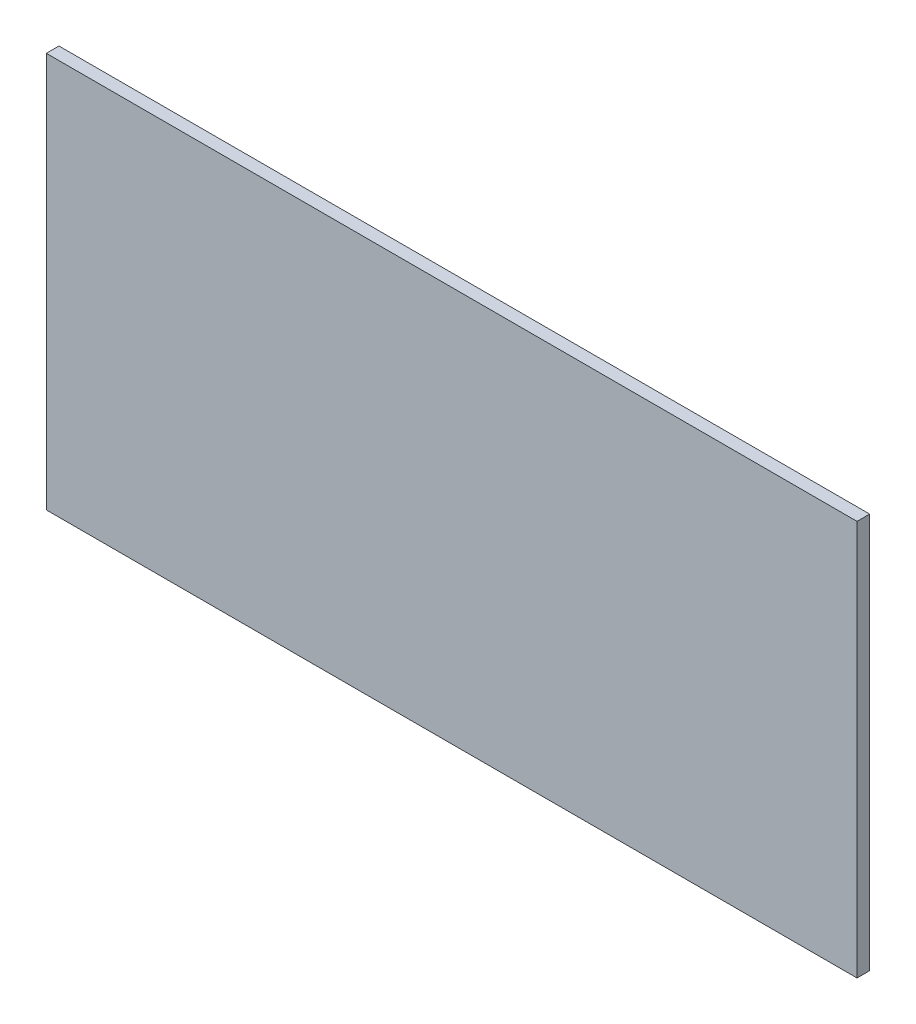
ISO-10303-21;
HEADER;
FILE_DESCRIPTION(('STEP AP214'),'2;1');
FILE_NAME('part.step','',(''),(''),'','','');
FILE_SCHEMA(('AUTOMOTIVE_DESIGN { 1 0 10303 214 1 1 1 1 }'));
ENDSEC;
DATA;
#1=APPLICATION_CONTEXT('core data for automotive mechanical design processes');
#2=APPLICATION_PROTOCOL_DEFINITION('international standard','automotive_design',2000,#1);
#3=PRODUCT_CONTEXT('',#1,'mechanical');
#4=PRODUCT('Part','Part','',(#3));
#5=PRODUCT_RELATED_PRODUCT_CATEGORY('part','',(#4));
#6=PRODUCT_DEFINITION_FORMATION('','',#4);
#7=PRODUCT_DEFINITION_CONTEXT('part definition',#1,'design');
#8=PRODUCT_DEFINITION('design','',#6,#7);
#9=PRODUCT_DEFINITION_SHAPE('','',#8);
#10=(LENGTH_UNIT() NAMED_UNIT(*) SI_UNIT(.MILLI.,.METRE.));
#11=(NAMED_UNIT(*) PLANE_ANGLE_UNIT() SI_UNIT($,.RADIAN.));
#12=(NAMED_UNIT(*) SI_UNIT($,.STERADIAN.) SOLID_ANGLE_UNIT());
#13=UNCERTAINTY_MEASURE_WITH_UNIT(LENGTH_MEASURE(1.E-05),#10,'distance_accuracy_value','');
#14=(GEOMETRIC_REPRESENTATION_CONTEXT(3) GLOBAL_UNCERTAINTY_ASSIGNED_CONTEXT((#13)) GLOBAL_UNIT_ASSIGNED_CONTEXT((#10,
#11,#12)) REPRESENTATION_CONTEXT('',''));
#15=CARTESIAN_POINT('',(0.,0.,0.));
#16=DIRECTION('',(0.,0.,1.));
#17=DIRECTION('',(1.,0.,0.));
#18=AXIS2_PLACEMENT_3D('',#15,#16,#17);
#19=CARTESIAN_POINT('',(585.7875,2.25518708062985E-13,18.25625));
#20=DIRECTION('',(-1.,0.,0.));
#21=DIRECTION('',(0.,-1.,0.));
#22=AXIS2_PLACEMENT_3D('',#19,#20,#21);
#23=PLANE('',#22);
#24=DIRECTION('',(0.,1.,0.));
#25=VECTOR('',#24,1.);
#26=CARTESIAN_POINT('',(585.7875,2.25518708062985E-13,0.));
#27=LINE('',#26,#25);
#28=CARTESIAN_POINT('',(585.7875,2.25518708062985E-13,0.));
#29=VERTEX_POINT('',#28);
#30=CARTESIAN_POINT('',(585.7875,571.5,0.));
#31=VERTEX_POINT('',#30);
#32=EDGE_CURVE('E96',#29,#31,#27,.T.);
#33=ORIENTED_EDGE('',*,*,#32,.T.);
#34=DIRECTION('',(0.,0.,-1.));
#35=VECTOR('',#34,1.);
#36=CARTESIAN_POINT('',(585.7875,571.5,18.25625));
#37=LINE('',#36,#35);
#38=CARTESIAN_POINT('',(585.7875,571.5,18.25625));
#39=VERTEX_POINT('',#38);
#40=EDGE_CURVE('E11',#39,#31,#37,.T.);
#41=ORIENTED_EDGE('',*,*,#40,.F.);
#42=DIRECTION('',(0.,1.,0.));
#43=VECTOR('',#42,1.);
#44=CARTESIAN_POINT('',(585.7875,2.25518708062985E-13,18.25625));
#45=LINE('',#44,#43);
#46=CARTESIAN_POINT('',(585.7875,2.25518708062985E-13,18.25625));
#47=VERTEX_POINT('',#46);
#48=EDGE_CURVE('E84',#47,#39,#45,.T.);
#49=ORIENTED_EDGE('',*,*,#48,.F.);
#50=DIRECTION('',(0.,0.,-1.));
#51=VECTOR('',#50,1.);
#52=CARTESIAN_POINT('',(585.7875,2.25518708062985E-13,18.25625));
#53=LINE('',#52,#51);
#54=EDGE_CURVE('E92',#47,#29,#53,.T.);
#55=ORIENTED_EDGE('',*,*,#54,.T.);
#56=EDGE_LOOP('',(#33,#41,#49,#55));
#57=FACE_BOUND('',#56,.T.);
#58=ADVANCED_FACE('F33',(#57),#23,.F.);
#59=CARTESIAN_POINT('',(585.7875,571.5,18.25625));
#60=DIRECTION('',(0.,-1.,0.));
#61=DIRECTION('',(1.,0.,0.));
#62=AXIS2_PLACEMENT_3D('',#59,#60,#61);
#63=PLANE('',#62);
#64=DIRECTION('',(-1.,0.,0.));
#65=VECTOR('',#64,1.);
#66=CARTESIAN_POINT('',(585.7875,571.5,0.));
#67=LINE('',#66,#65);
#68=CARTESIAN_POINT('',(-585.7875,571.5,0.));
#69=VERTEX_POINT('',#68);
#70=EDGE_CURVE('E88',#31,#69,#67,.T.);
#71=ORIENTED_EDGE('',*,*,#70,.T.);
#72=DIRECTION('',(0.,0.,-1.));
#73=VECTOR('',#72,1.);
#74=CARTESIAN_POINT('',(-585.7875,571.5,18.25625));
#75=LINE('',#74,#73);
#76=CARTESIAN_POINT('',(-585.7875,571.5,18.25625));
#77=VERTEX_POINT('',#76);
#78=EDGE_CURVE('E41',#77,#69,#75,.T.);
#79=ORIENTED_EDGE('',*,*,#78,.F.);
#80=DIRECTION('',(-1.,0.,0.));
#81=VECTOR('',#80,1.);
#82=CARTESIAN_POINT('',(585.7875,571.5,18.25625));
#83=LINE('',#82,#81);
#84=EDGE_CURVE('E79',#39,#77,#83,.T.);
#85=ORIENTED_EDGE('',*,*,#84,.F.);
#86=ORIENTED_EDGE('',*,*,#40,.T.);
#87=EDGE_LOOP('',(#71,#79,#85,#86));
#88=FACE_BOUND('',#87,.T.);
#89=ADVANCED_FACE('F87',(#88),#63,.F.);
#90=CARTESIAN_POINT('',(-585.7875,-1.3317268536478E-13,18.25625));
#91=DIRECTION('',(1.,0.,0.));
#92=DIRECTION('',(0.,0.,-1.));
#93=AXIS2_PLACEMENT_3D('',#90,#91,#92);
#94=PLANE('',#93);
#95=DIRECTION('',(0.,-1.,0.));
#96=VECTOR('',#95,1.);
#97=CARTESIAN_POINT('',(-585.7875,-1.3317268536478E-13,0.));
#98=LINE('',#97,#96);
#99=CARTESIAN_POINT('',(-585.7875,-1.3317268536478E-13,0.));
#100=VERTEX_POINT('',#99);
#101=EDGE_CURVE('E66',#69,#100,#98,.T.);
#102=ORIENTED_EDGE('',*,*,#101,.T.);
#103=DIRECTION('',(0.,0.,-1.));
#104=VECTOR('',#103,1.);
#105=CARTESIAN_POINT('',(-585.7875,-1.3317268536478E-13,18.25625));
#106=LINE('',#105,#104);
#107=CARTESIAN_POINT('',(-585.7875,-1.3317268536478E-13,18.25625));
#108=VERTEX_POINT('',#107);
#109=EDGE_CURVE('E89',#108,#100,#106,.T.);
#110=ORIENTED_EDGE('',*,*,#109,.F.);
#111=DIRECTION('',(0.,-1.,0.));
#112=VECTOR('',#111,1.);
#113=CARTESIAN_POINT('',(-585.7875,-1.3317268536478E-13,18.25625));
#114=LINE('',#113,#112);
#115=EDGE_CURVE('E82',#77,#108,#114,.T.);
#116=ORIENTED_EDGE('',*,*,#115,.F.);
#117=ORIENTED_EDGE('',*,*,#78,.T.);
#118=EDGE_LOOP('',(#102,#110,#116,#117));
#119=FACE_BOUND('',#118,.T.);
#120=ADVANCED_FACE('F90',(#119),#94,.F.);
#121=CARTESIAN_POINT('',(585.7875,2.25518708062985E-13,18.25625));
#122=DIRECTION('',(0.,1.,0.));
#123=DIRECTION('',(-1.,0.,0.));
#124=AXIS2_PLACEMENT_3D('',#121,#122,#123);
#125=PLANE('',#124);
#126=DIRECTION('',(1.,0.,0.));
#127=VECTOR('',#126,1.);
#128=CARTESIAN_POINT('',(585.7875,2.25518708062985E-13,0.));
#129=LINE('',#128,#127);
#130=EDGE_CURVE('E72',#100,#29,#129,.T.);
#131=ORIENTED_EDGE('',*,*,#130,.T.);
#132=ORIENTED_EDGE('',*,*,#54,.F.);
#133=DIRECTION('',(1.,0.,0.));
#134=VECTOR('',#133,1.);
#135=CARTESIAN_POINT('',(585.7875,2.25518708062985E-13,18.25625));
#136=LINE('',#135,#134);
#137=EDGE_CURVE('E49',#108,#47,#136,.T.);
#138=ORIENTED_EDGE('',*,*,#137,.F.);
#139=ORIENTED_EDGE('',*,*,#109,.T.);
#140=EDGE_LOOP('',(#131,#132,#138,#139));
#141=FACE_BOUND('',#140,.T.);
#142=ADVANCED_FACE('F103',(#141),#125,.F.);
#143=CARTESIAN_POINT('',(0.,0.,18.25625));
#144=DIRECTION('',(0.,0.,1.));
#145=DIRECTION('',(1.,0.,0.));
#146=AXIS2_PLACEMENT_3D('',#143,#144,#145);
#147=PLANE('',#146);
#148=ORIENTED_EDGE('',*,*,#48,.T.);
#149=ORIENTED_EDGE('',*,*,#84,.T.);
#150=ORIENTED_EDGE('',*,*,#115,.T.);
#151=ORIENTED_EDGE('',*,*,#137,.T.);
#152=EDGE_LOOP('',(#148,#149,#150,#151));
#153=FACE_BOUND('',#152,.T.);
#154=ADVANCED_FACE('F80',(#153),#147,.T.);
#155=CARTESIAN_POINT('',(0.,0.,0.));
#156=DIRECTION('',(0.,0.,1.));
#157=DIRECTION('',(1.,0.,0.));
#158=AXIS2_PLACEMENT_3D('',#155,#156,#157);
#159=PLANE('',#158);
#160=ORIENTED_EDGE('',*,*,#32,.F.);
#161=ORIENTED_EDGE('',*,*,#130,.F.);
#162=ORIENTED_EDGE('',*,*,#101,.F.);
#163=ORIENTED_EDGE('',*,*,#70,.F.);
#164=EDGE_LOOP('',(#160,#161,#162,#163));
#165=FACE_BOUND('',#164,.T.);
#166=ADVANCED_FACE('F106',(#165),#159,.F.);
#167=CLOSED_SHELL('',(#58,#89,#120,#142,#154,#166));
#168=MANIFOLD_SOLID_BREP('B2',#167);
#169=ADVANCED_BREP_SHAPE_REPRESENTATION('',(#18,#168),#14);
#170=SHAPE_DEFINITION_REPRESENTATION(#9,#169);
ENDSEC;
END-ISO-10303-21;
